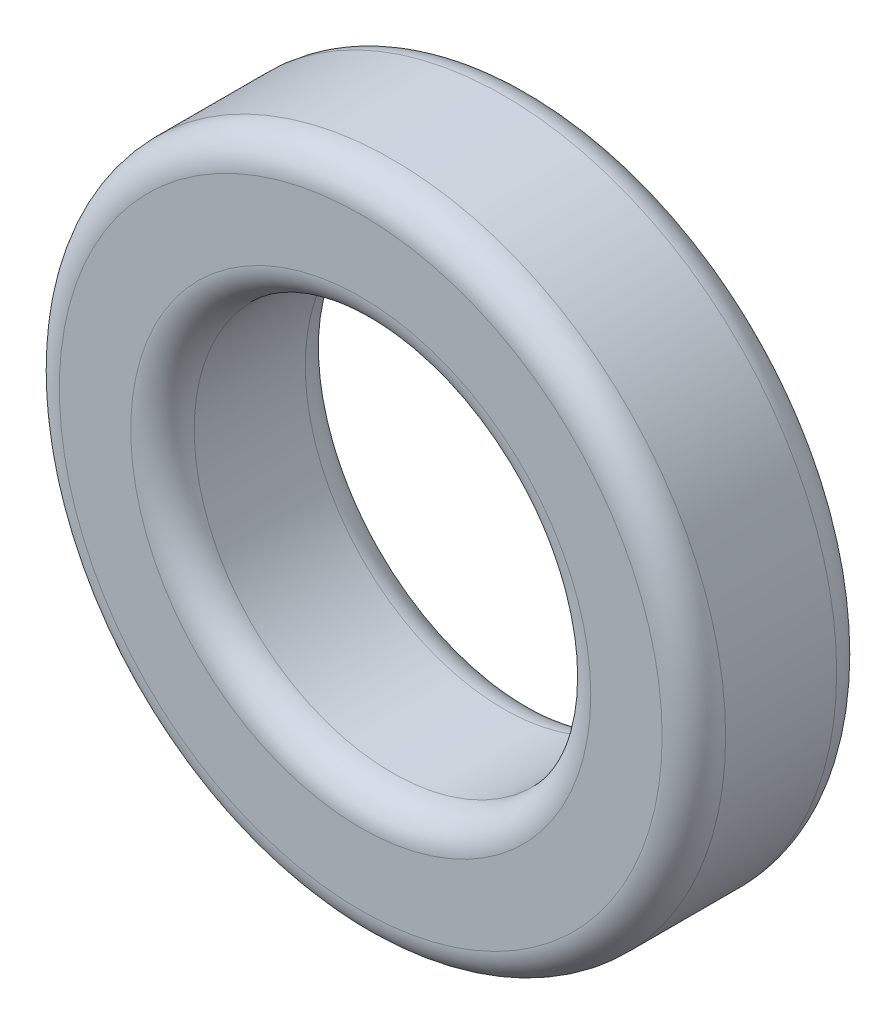
ISO-10303-21;
HEADER;
FILE_DESCRIPTION(('STEP AP214'),'2;1');
FILE_NAME('part.step','',(''),(''),'','','');
FILE_SCHEMA(('AUTOMOTIVE_DESIGN { 1 0 10303 214 1 1 1 1 }'));
ENDSEC;
DATA;
#1=APPLICATION_CONTEXT('core data for automotive mechanical design processes');
#2=APPLICATION_PROTOCOL_DEFINITION('international standard','automotive_design',2000,#1);
#3=PRODUCT_CONTEXT('',#1,'mechanical');
#4=PRODUCT('Part','Part','',(#3));
#5=PRODUCT_RELATED_PRODUCT_CATEGORY('part','',(#4));
#6=PRODUCT_DEFINITION_FORMATION('','',#4);
#7=PRODUCT_DEFINITION_CONTEXT('part definition',#1,'design');
#8=PRODUCT_DEFINITION('design','',#6,#7);
#9=PRODUCT_DEFINITION_SHAPE('','',#8);
#10=(LENGTH_UNIT() NAMED_UNIT(*) SI_UNIT(.MILLI.,.METRE.));
#11=(NAMED_UNIT(*) PLANE_ANGLE_UNIT() SI_UNIT($,.RADIAN.));
#12=(NAMED_UNIT(*) SI_UNIT($,.STERADIAN.) SOLID_ANGLE_UNIT());
#13=UNCERTAINTY_MEASURE_WITH_UNIT(LENGTH_MEASURE(1.E-05),#10,'distance_accuracy_value','');
#14=(GEOMETRIC_REPRESENTATION_CONTEXT(3) GLOBAL_UNCERTAINTY_ASSIGNED_CONTEXT((#13)) GLOBAL_UNIT_ASSIGNED_CONTEXT((#10,
#11,#12)) REPRESENTATION_CONTEXT('',''));
#15=CARTESIAN_POINT('',(0.,0.,0.));
#16=DIRECTION('',(0.,0.,1.));
#17=DIRECTION('',(1.,0.,0.));
#18=AXIS2_PLACEMENT_3D('',#15,#16,#17);
#19=CARTESIAN_POINT('',(0.,0.,11.));
#20=DIRECTION('',(0.,0.,1.));
#21=DIRECTION('',(1.,0.,0.));
#22=AXIS2_PLACEMENT_3D('',#19,#20,#21);
#23=PLANE('',#22);
#24=CARTESIAN_POINT('',(0.,0.,11.));
#25=DIRECTION('',(0.,0.,1.));
#26=DIRECTION('',(1.,0.,0.));
#27=AXIS2_PLACEMENT_3D('',#24,#25,#26);
#28=CIRCLE('',#27,14.5);
#29=CARTESIAN_POINT('',(14.5,0.,11.));
#30=VERTEX_POINT('',#29);
#31=EDGE_CURVE('E44',#30,#30,#28,.F.);
#32=ORIENTED_EDGE('',*,*,#31,.T.);
#33=EDGE_LOOP('',(#32));
#34=FACE_BOUND('',#33,.T.);
#35=CARTESIAN_POINT('',(0.,0.,11.));
#36=DIRECTION('',(0.,0.,1.));
#37=DIRECTION('',(1.,0.,0.));
#38=AXIS2_PLACEMENT_3D('',#35,#36,#37);
#39=CIRCLE('',#38,19.);
#40=CARTESIAN_POINT('',(19.,0.,11.));
#41=VERTEX_POINT('',#40);
#42=EDGE_CURVE('E48',#41,#41,#39,.T.);
#43=ORIENTED_EDGE('',*,*,#42,.T.);
#44=EDGE_LOOP('',(#43));
#45=FACE_BOUND('',#44,.T.);
#46=ADVANCED_FACE('F33',(#34,#45),#23,.T.);
#47=CARTESIAN_POINT('',(0.,0.,0.));
#48=DIRECTION('',(0.,0.,1.));
#49=DIRECTION('',(1.,0.,0.));
#50=AXIS2_PLACEMENT_3D('',#47,#48,#49);
#51=PLANE('',#50);
#52=CARTESIAN_POINT('',(0.,0.,0.));
#53=DIRECTION('',(0.,0.,1.));
#54=DIRECTION('',(1.,0.,0.));
#55=AXIS2_PLACEMENT_3D('',#52,#53,#54);
#56=CIRCLE('',#55,14.5);
#57=CARTESIAN_POINT('',(14.5,0.,0.));
#58=VERTEX_POINT('',#57);
#59=EDGE_CURVE('E59',#58,#58,#56,.T.);
#60=ORIENTED_EDGE('',*,*,#59,.T.);
#61=EDGE_LOOP('',(#60));
#62=FACE_BOUND('',#61,.T.);
#63=CARTESIAN_POINT('',(0.,0.,0.));
#64=DIRECTION('',(0.,0.,1.));
#65=DIRECTION('',(1.,0.,0.));
#66=AXIS2_PLACEMENT_3D('',#63,#64,#65);
#67=CIRCLE('',#66,19.);
#68=CARTESIAN_POINT('',(19.,0.,0.));
#69=VERTEX_POINT('',#68);
#70=EDGE_CURVE('E62',#69,#69,#67,.F.);
#71=ORIENTED_EDGE('',*,*,#70,.T.);
#72=EDGE_LOOP('',(#71));
#73=FACE_BOUND('',#72,.T.);
#74=ADVANCED_FACE('F66',(#62,#73),#51,.F.);
#75=CARTESIAN_POINT('',(0.,0.,11.));
#76=DIRECTION('',(0.,0.,-1.));
#77=DIRECTION('',(-1.,0.,0.));
#78=AXIS2_PLACEMENT_3D('',#75,#76,#77);
#79=CYLINDRICAL_SURFACE('',#78,21.);
#80=CARTESIAN_POINT('',(0.,0.,2.));
#81=DIRECTION('',(0.,0.,1.));
#82=DIRECTION('',(1.,0.,0.));
#83=AXIS2_PLACEMENT_3D('',#80,#81,#82);
#84=CIRCLE('',#83,21.);
#85=CARTESIAN_POINT('',(21.,0.,2.));
#86=VERTEX_POINT('',#85);
#87=EDGE_CURVE('E10',#86,#86,#84,.T.);
#88=ORIENTED_EDGE('',*,*,#87,.T.);
#89=EDGE_LOOP('',(#88));
#90=FACE_BOUND('',#89,.T.);
#91=CARTESIAN_POINT('',(0.,0.,9.));
#92=DIRECTION('',(0.,0.,1.));
#93=DIRECTION('',(1.,0.,0.));
#94=AXIS2_PLACEMENT_3D('',#91,#92,#93);
#95=CIRCLE('',#94,21.);
#96=CARTESIAN_POINT('',(21.,0.,9.));
#97=VERTEX_POINT('',#96);
#98=EDGE_CURVE('E40',#97,#97,#95,.F.);
#99=ORIENTED_EDGE('',*,*,#98,.T.);
#100=EDGE_LOOP('',(#99));
#101=FACE_BOUND('',#100,.T.);
#102=ADVANCED_FACE('F86',(#90,#101),#79,.T.);
#103=CARTESIAN_POINT('',(0.,0.,11.));
#104=DIRECTION('',(0.,0.,-1.));
#105=DIRECTION('',(-1.,0.,0.));
#106=AXIS2_PLACEMENT_3D('',#103,#104,#105);
#107=CYLINDRICAL_SURFACE('',#106,12.5);
#108=CARTESIAN_POINT('',(0.,0.,2.));
#109=DIRECTION('',(0.,0.,1.));
#110=DIRECTION('',(1.,0.,0.));
#111=AXIS2_PLACEMENT_3D('',#108,#109,#110);
#112=CIRCLE('',#111,12.5);
#113=CARTESIAN_POINT('',(12.5,0.,2.));
#114=VERTEX_POINT('',#113);
#115=EDGE_CURVE('E53',#114,#114,#112,.F.);
#116=ORIENTED_EDGE('',*,*,#115,.T.);
#117=EDGE_LOOP('',(#116));
#118=FACE_BOUND('',#117,.T.);
#119=CARTESIAN_POINT('',(0.,0.,9.));
#120=DIRECTION('',(0.,0.,1.));
#121=DIRECTION('',(1.,0.,0.));
#122=AXIS2_PLACEMENT_3D('',#119,#120,#121);
#123=CIRCLE('',#122,12.5);
#124=CARTESIAN_POINT('',(12.5,0.,9.));
#125=VERTEX_POINT('',#124);
#126=EDGE_CURVE('E56',#125,#125,#123,.T.);
#127=ORIENTED_EDGE('',*,*,#126,.T.);
#128=EDGE_LOOP('',(#127));
#129=FACE_BOUND('',#128,.T.);
#130=ADVANCED_FACE('F91',(#118,#129),#107,.F.);
#131=CARTESIAN_POINT('',(0.,0.,2.));
#132=DIRECTION('',(0.,0.,1.));
#133=DIRECTION('',(1.,0.,0.));
#134=AXIS2_PLACEMENT_3D('',#131,#132,#133);
#135=TOROIDAL_SURFACE('',#134,14.5,2.);
#136=ORIENTED_EDGE('',*,*,#115,.F.);
#137=EDGE_LOOP('',(#136));
#138=FACE_BOUND('',#137,.T.);
#139=ORIENTED_EDGE('',*,*,#59,.F.);
#140=EDGE_LOOP('',(#139));
#141=FACE_BOUND('',#140,.T.);
#142=ADVANCED_FACE('F77',(#138,#141),#135,.T.);
#143=CARTESIAN_POINT('',(0.,0.,9.));
#144=DIRECTION('',(0.,0.,1.));
#145=DIRECTION('',(1.,0.,0.));
#146=AXIS2_PLACEMENT_3D('',#143,#144,#145);
#147=TOROIDAL_SURFACE('',#146,14.5,2.);
#148=ORIENTED_EDGE('',*,*,#31,.F.);
#149=EDGE_LOOP('',(#148));
#150=FACE_BOUND('',#149,.T.);
#151=ORIENTED_EDGE('',*,*,#126,.F.);
#152=EDGE_LOOP('',(#151));
#153=FACE_BOUND('',#152,.T.);
#154=ADVANCED_FACE('F71',(#150,#153),#147,.T.);
#155=CARTESIAN_POINT('',(0.,0.,2.));
#156=DIRECTION('',(0.,0.,1.));
#157=DIRECTION('',(1.,0.,0.));
#158=AXIS2_PLACEMENT_3D('',#155,#156,#157);
#159=TOROIDAL_SURFACE('',#158,19.,2.);
#160=ORIENTED_EDGE('',*,*,#70,.F.);
#161=EDGE_LOOP('',(#160));
#162=FACE_BOUND('',#161,.T.);
#163=ORIENTED_EDGE('',*,*,#87,.F.);
#164=EDGE_LOOP('',(#163));
#165=FACE_BOUND('',#164,.T.);
#166=ADVANCED_FACE('F68',(#162,#165),#159,.T.);
#167=CARTESIAN_POINT('',(0.,0.,9.));
#168=DIRECTION('',(0.,0.,1.));
#169=DIRECTION('',(1.,0.,0.));
#170=AXIS2_PLACEMENT_3D('',#167,#168,#169);
#171=TOROIDAL_SURFACE('',#170,19.,2.);
#172=ORIENTED_EDGE('',*,*,#98,.F.);
#173=EDGE_LOOP('',(#172));
#174=FACE_BOUND('',#173,.T.);
#175=ORIENTED_EDGE('',*,*,#42,.F.);
#176=EDGE_LOOP('',(#175));
#177=FACE_BOUND('',#176,.T.);
#178=ADVANCED_FACE('F35',(#174,#177),#171,.T.);
#179=CLOSED_SHELL('',(#46,#74,#102,#130,#142,#154,#166,#178));
#180=MANIFOLD_SOLID_BREP('B2',#179);
#181=ADVANCED_BREP_SHAPE_REPRESENTATION('',(#18,#180),#14);
#182=SHAPE_DEFINITION_REPRESENTATION(#9,#181);
ENDSEC;
END-ISO-10303-21;
